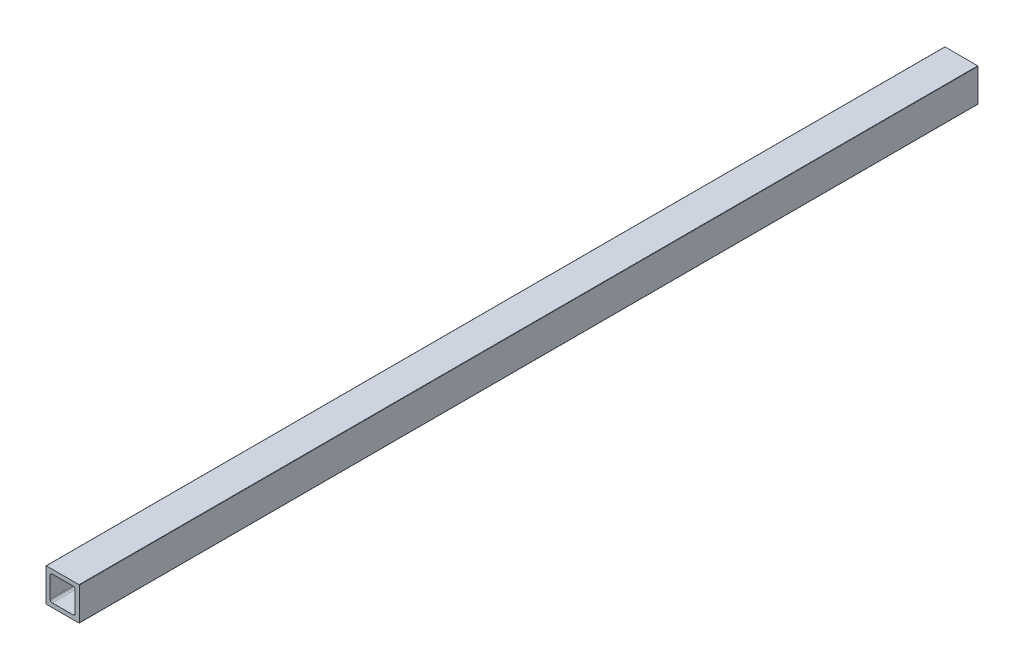
ISO-10303-21;
HEADER;
FILE_DESCRIPTION(('STEP AP214'),'2;1');
FILE_NAME('part.step','',(''),(''),'','','');
FILE_SCHEMA(('AUTOMOTIVE_DESIGN { 1 0 10303 214 1 1 1 1 }'));
ENDSEC;
DATA;
#1=APPLICATION_CONTEXT('core data for automotive mechanical design processes');
#2=APPLICATION_PROTOCOL_DEFINITION('international standard','automotive_design',2000,#1);
#3=PRODUCT_CONTEXT('',#1,'mechanical');
#4=PRODUCT('Part','Part','',(#3));
#5=PRODUCT_RELATED_PRODUCT_CATEGORY('part','',(#4));
#6=PRODUCT_DEFINITION_FORMATION('','',#4);
#7=PRODUCT_DEFINITION_CONTEXT('part definition',#1,'design');
#8=PRODUCT_DEFINITION('design','',#6,#7);
#9=PRODUCT_DEFINITION_SHAPE('','',#8);
#10=(LENGTH_UNIT() NAMED_UNIT(*) SI_UNIT(.MILLI.,.METRE.));
#11=(NAMED_UNIT(*) PLANE_ANGLE_UNIT() SI_UNIT($,.RADIAN.));
#12=(NAMED_UNIT(*) SI_UNIT($,.STERADIAN.) SOLID_ANGLE_UNIT());
#13=UNCERTAINTY_MEASURE_WITH_UNIT(LENGTH_MEASURE(1.E-05),#10,'distance_accuracy_value','');
#14=(GEOMETRIC_REPRESENTATION_CONTEXT(3) GLOBAL_UNCERTAINTY_ASSIGNED_CONTEXT((#13)) GLOBAL_UNIT_ASSIGNED_CONTEXT((#10,
#11,#12)) REPRESENTATION_CONTEXT('',''));
#15=CARTESIAN_POINT('',(0.,0.,0.));
#16=DIRECTION('',(0.,0.,1.));
#17=DIRECTION('',(1.,0.,0.));
#18=AXIS2_PLACEMENT_3D('',#15,#16,#17);
#19=CARTESIAN_POINT('',(0.254,0.254,0.));
#20=DIRECTION('',(0.,0.,-1.));
#21=DIRECTION('',(0.,-1.,0.));
#22=AXIS2_PLACEMENT_3D('',#19,#20,#21);
#23=PLANE('',#22);
#24=CARTESIAN_POINT('',(0.254,0.254,0.));
#25=DIRECTION('',(0.,0.,1.));
#26=DIRECTION('',(-1.,0.,0.));
#27=AXIS2_PLACEMENT_3D('',#24,#25,#26);
#28=CIRCLE('',#27,0.254);
#29=CARTESIAN_POINT('',(0.,0.254,0.));
#30=VERTEX_POINT('',#29);
#31=CARTESIAN_POINT('',(0.254,0.,0.));
#32=VERTEX_POINT('',#31);
#33=EDGE_CURVE('E193',#30,#32,#28,.T.);
#34=ORIENTED_EDGE('',*,*,#33,.F.);
#35=DIRECTION('',(0.,-1.,0.));
#36=VECTOR('',#35,1.);
#37=CARTESIAN_POINT('',(0.,0.254,0.));
#38=LINE('',#37,#36);
#39=CARTESIAN_POINT('',(0.,25.146,0.));
#40=VERTEX_POINT('',#39);
#41=EDGE_CURVE('E191',#40,#30,#38,.T.);
#42=ORIENTED_EDGE('',*,*,#41,.F.);
#43=CARTESIAN_POINT('',(0.254,25.146,0.));
#44=DIRECTION('',(0.,0.,1.));
#45=DIRECTION('',(-1.,0.,0.));
#46=AXIS2_PLACEMENT_3D('',#43,#44,#45);
#47=CIRCLE('',#46,0.254);
#48=CARTESIAN_POINT('',(0.254,25.4,0.));
#49=VERTEX_POINT('',#48);
#50=EDGE_CURVE('E213',#49,#40,#47,.T.);
#51=ORIENTED_EDGE('',*,*,#50,.F.);
#52=DIRECTION('',(-1.,0.,0.));
#53=VECTOR('',#52,1.);
#54=CARTESIAN_POINT('',(0.254,25.4,0.));
#55=LINE('',#54,#53);
#56=CARTESIAN_POINT('',(25.146,25.4,0.));
#57=VERTEX_POINT('',#56);
#58=EDGE_CURVE('E204',#57,#49,#55,.T.);
#59=ORIENTED_EDGE('',*,*,#58,.F.);
#60=CARTESIAN_POINT('',(25.146,25.146,0.));
#61=DIRECTION('',(0.,0.,1.));
#62=DIRECTION('',(-1.,0.,0.));
#63=AXIS2_PLACEMENT_3D('',#60,#61,#62);
#64=CIRCLE('',#63,0.254);
#65=CARTESIAN_POINT('',(25.4,25.146,0.));
#66=VERTEX_POINT('',#65);
#67=EDGE_CURVE('E236',#66,#57,#64,.T.);
#68=ORIENTED_EDGE('',*,*,#67,.F.);
#69=DIRECTION('',(0.,1.,0.));
#70=VECTOR('',#69,1.);
#71=CARTESIAN_POINT('',(25.4,0.254,0.));
#72=LINE('',#71,#70);
#73=CARTESIAN_POINT('',(25.4,0.254,0.));
#74=VERTEX_POINT('',#73);
#75=EDGE_CURVE('E235',#74,#66,#72,.T.);
#76=ORIENTED_EDGE('',*,*,#75,.F.);
#77=CARTESIAN_POINT('',(25.146,0.254,0.));
#78=DIRECTION('',(0.,0.,1.));
#79=DIRECTION('',(1.,0.,0.));
#80=AXIS2_PLACEMENT_3D('',#77,#78,#79);
#81=CIRCLE('',#80,0.254);
#82=CARTESIAN_POINT('',(25.146,0.,0.));
#83=VERTEX_POINT('',#82);
#84=EDGE_CURVE('E206',#83,#74,#81,.T.);
#85=ORIENTED_EDGE('',*,*,#84,.F.);
#86=DIRECTION('',(1.,0.,0.));
#87=VECTOR('',#86,1.);
#88=CARTESIAN_POINT('',(0.254,0.,0.));
#89=LINE('',#88,#87);
#90=EDGE_CURVE('E194',#32,#83,#89,.T.);
#91=ORIENTED_EDGE('',*,*,#90,.F.);
#92=EDGE_LOOP('',(#34,#42,#51,#59,#68,#76,#85,#91));
#93=FACE_BOUND('',#92,.T.);
#94=DIRECTION('',(0.,-1.,0.));
#95=VECTOR('',#94,1.);
#96=CARTESIAN_POINT('',(3.175,4.7625,0.));
#97=LINE('',#96,#95);
#98=CARTESIAN_POINT('',(3.175,20.6375,0.));
#99=VERTEX_POINT('',#98);
#100=CARTESIAN_POINT('',(3.175,4.7625,0.));
#101=VERTEX_POINT('',#100);
#102=EDGE_CURVE('E52',#99,#101,#97,.T.);
#103=ORIENTED_EDGE('',*,*,#102,.T.);
#104=CARTESIAN_POINT('',(4.7625,4.7625,0.));
#105=DIRECTION('',(0.,0.,1.));
#106=DIRECTION('',(1.,0.,0.));
#107=AXIS2_PLACEMENT_3D('',#104,#105,#106);
#108=CIRCLE('',#107,1.5875);
#109=CARTESIAN_POINT('',(4.7625,3.175,0.));
#110=VERTEX_POINT('',#109);
#111=EDGE_CURVE('E266',#101,#110,#108,.T.);
#112=ORIENTED_EDGE('',*,*,#111,.T.);
#113=DIRECTION('',(1.,0.,0.));
#114=VECTOR('',#113,1.);
#115=CARTESIAN_POINT('',(4.7625,3.175,0.));
#116=LINE('',#115,#114);
#117=CARTESIAN_POINT('',(20.6375,3.175,0.));
#118=VERTEX_POINT('',#117);
#119=EDGE_CURVE('E250',#110,#118,#116,.T.);
#120=ORIENTED_EDGE('',*,*,#119,.T.);
#121=CARTESIAN_POINT('',(20.6375,4.7625,0.));
#122=DIRECTION('',(0.,0.,1.));
#123=DIRECTION('',(-1.,0.,0.));
#124=AXIS2_PLACEMENT_3D('',#121,#122,#123);
#125=CIRCLE('',#124,1.5875);
#126=CARTESIAN_POINT('',(22.225,4.7625,0.));
#127=VERTEX_POINT('',#126);
#128=EDGE_CURVE('E223',#118,#127,#125,.T.);
#129=ORIENTED_EDGE('',*,*,#128,.T.);
#130=DIRECTION('',(0.,1.,0.));
#131=VECTOR('',#130,1.);
#132=CARTESIAN_POINT('',(22.225,4.7625,0.));
#133=LINE('',#132,#131);
#134=CARTESIAN_POINT('',(22.225,20.6375,0.));
#135=VERTEX_POINT('',#134);
#136=EDGE_CURVE('E219',#127,#135,#133,.T.);
#137=ORIENTED_EDGE('',*,*,#136,.T.);
#138=CARTESIAN_POINT('',(20.6375,20.6375,0.));
#139=DIRECTION('',(0.,0.,1.));
#140=DIRECTION('',(-1.,0.,0.));
#141=AXIS2_PLACEMENT_3D('',#138,#139,#140);
#142=CIRCLE('',#141,1.5875);
#143=CARTESIAN_POINT('',(20.6375,22.225,0.));
#144=VERTEX_POINT('',#143);
#145=EDGE_CURVE('E224',#135,#144,#142,.T.);
#146=ORIENTED_EDGE('',*,*,#145,.T.);
#147=DIRECTION('',(-1.,0.,0.));
#148=VECTOR('',#147,1.);
#149=CARTESIAN_POINT('',(4.7625,22.225,0.));
#150=LINE('',#149,#148);
#151=CARTESIAN_POINT('',(4.7625,22.225,0.));
#152=VERTEX_POINT('',#151);
#153=EDGE_CURVE('E229',#144,#152,#150,.T.);
#154=ORIENTED_EDGE('',*,*,#153,.T.);
#155=CARTESIAN_POINT('',(4.7625,20.6375,0.));
#156=DIRECTION('',(0.,0.,1.));
#157=DIRECTION('',(-1.,0.,0.));
#158=AXIS2_PLACEMENT_3D('',#155,#156,#157);
#159=CIRCLE('',#158,1.5875);
#160=EDGE_CURVE('E197',#152,#99,#159,.T.);
#161=ORIENTED_EDGE('',*,*,#160,.T.);
#162=EDGE_LOOP('',(#103,#112,#120,#129,#137,#146,#154,#161));
#163=FACE_BOUND('',#162,.T.);
#164=ADVANCED_FACE('F44',(#93,#163),#23,.T.);
#165=CARTESIAN_POINT('',(0.254,0.254,1828.8));
#166=DIRECTION('',(0.,0.,-1.));
#167=DIRECTION('',(-1.,0.,0.));
#168=AXIS2_PLACEMENT_3D('',#165,#166,#167);
#169=CYLINDRICAL_SURFACE('',#168,0.254);
#170=CARTESIAN_POINT('',(0.254,0.254,685.8));
#171=DIRECTION('',(0.,0.,-1.));
#172=DIRECTION('',(-1.,0.,0.));
#173=AXIS2_PLACEMENT_3D('',#170,#171,#172);
#174=CIRCLE('',#173,0.254);
#175=CARTESIAN_POINT('',(0.,0.254,685.8));
#176=VERTEX_POINT('',#175);
#177=CARTESIAN_POINT('',(0.254,0.,685.8));
#178=VERTEX_POINT('',#177);
#179=EDGE_CURVE('E172',#176,#178,#174,.F.);
#180=ORIENTED_EDGE('',*,*,#179,.F.);
#181=DIRECTION('',(0.,0.,-1.));
#182=VECTOR('',#181,1.);
#183=CARTESIAN_POINT('',(0.,0.254,1828.8));
#184=LINE('',#183,#182);
#185=EDGE_CURVE('E183',#176,#30,#184,.T.);
#186=ORIENTED_EDGE('',*,*,#185,.T.);
#187=ORIENTED_EDGE('',*,*,#33,.T.);
#188=DIRECTION('',(0.,0.,-1.));
#189=VECTOR('',#188,1.);
#190=CARTESIAN_POINT('',(0.254,0.,1828.8));
#191=LINE('',#190,#189);
#192=EDGE_CURVE('E185',#178,#32,#191,.T.);
#193=ORIENTED_EDGE('',*,*,#192,.F.);
#194=EDGE_LOOP('',(#180,#186,#187,#193));
#195=FACE_BOUND('',#194,.T.);
#196=ADVANCED_FACE('F181',(#195),#169,.T.);
#197=CARTESIAN_POINT('',(0.254,0.,1828.8));
#198=DIRECTION('',(0.,1.,0.));
#199=DIRECTION('',(1.,0.,0.));
#200=AXIS2_PLACEMENT_3D('',#197,#198,#199);
#201=PLANE('',#200);
#202=DIRECTION('',(0.,0.,-1.));
#203=VECTOR('',#202,1.);
#204=CARTESIAN_POINT('',(25.146,0.,1828.8));
#205=LINE('',#204,#203);
#206=CARTESIAN_POINT('',(25.146,0.,685.8));
#207=VERTEX_POINT('',#206);
#208=EDGE_CURVE('E210',#207,#83,#205,.T.);
#209=ORIENTED_EDGE('',*,*,#208,.F.);
#210=DIRECTION('',(1.,0.,0.));
#211=VECTOR('',#210,1.);
#212=CARTESIAN_POINT('',(0.,0.,685.8));
#213=LINE('',#212,#211);
#214=EDGE_CURVE('E177',#178,#207,#213,.T.);
#215=ORIENTED_EDGE('',*,*,#214,.F.);
#216=ORIENTED_EDGE('',*,*,#192,.T.);
#217=ORIENTED_EDGE('',*,*,#90,.T.);
#218=EDGE_LOOP('',(#209,#215,#216,#217));
#219=FACE_BOUND('',#218,.T.);
#220=ADVANCED_FACE('F289',(#219),#201,.F.);
#221=CARTESIAN_POINT('',(25.146,0.254,1828.8));
#222=DIRECTION('',(0.,0.,-1.));
#223=DIRECTION('',(-1.,0.,0.));
#224=AXIS2_PLACEMENT_3D('',#221,#222,#223);
#225=CYLINDRICAL_SURFACE('',#224,0.254);
#226=CARTESIAN_POINT('',(25.146,0.254,685.8));
#227=DIRECTION('',(0.,0.,-1.));
#228=DIRECTION('',(-1.,0.,0.));
#229=AXIS2_PLACEMENT_3D('',#226,#227,#228);
#230=CIRCLE('',#229,0.254);
#231=CARTESIAN_POINT('',(25.4,0.254,685.8));
#232=VERTEX_POINT('',#231);
#233=EDGE_CURVE('E187',#207,#232,#230,.F.);
#234=ORIENTED_EDGE('',*,*,#233,.F.);
#235=ORIENTED_EDGE('',*,*,#208,.T.);
#236=ORIENTED_EDGE('',*,*,#84,.T.);
#237=DIRECTION('',(0.,0.,-1.));
#238=VECTOR('',#237,1.);
#239=CARTESIAN_POINT('',(25.4,0.254,1828.8));
#240=LINE('',#239,#238);
#241=EDGE_CURVE('E233',#232,#74,#240,.T.);
#242=ORIENTED_EDGE('',*,*,#241,.F.);
#243=EDGE_LOOP('',(#234,#235,#236,#242));
#244=FACE_BOUND('',#243,.T.);
#245=ADVANCED_FACE('F283',(#244),#225,.T.);
#246=CARTESIAN_POINT('',(25.4,0.254,1828.8));
#247=DIRECTION('',(-1.,0.,0.));
#248=DIRECTION('',(0.,0.,1.));
#249=AXIS2_PLACEMENT_3D('',#246,#247,#248);
#250=PLANE('',#249);
#251=DIRECTION('',(0.,0.,-1.));
#252=VECTOR('',#251,1.);
#253=CARTESIAN_POINT('',(25.4,25.146,1828.8));
#254=LINE('',#253,#252);
#255=CARTESIAN_POINT('',(25.4,25.146,685.8));
#256=VERTEX_POINT('',#255);
#257=EDGE_CURVE('E258',#256,#66,#254,.T.);
#258=ORIENTED_EDGE('',*,*,#257,.F.);
#259=DIRECTION('',(0.,1.,0.));
#260=VECTOR('',#259,1.);
#261=CARTESIAN_POINT('',(25.4,0.,685.8));
#262=LINE('',#261,#260);
#263=EDGE_CURVE('E498',#232,#256,#262,.T.);
#264=ORIENTED_EDGE('',*,*,#263,.F.);
#265=ORIENTED_EDGE('',*,*,#241,.T.);
#266=ORIENTED_EDGE('',*,*,#75,.T.);
#267=EDGE_LOOP('',(#258,#264,#265,#266));
#268=FACE_BOUND('',#267,.T.);
#269=ADVANCED_FACE('F288',(#268),#250,.F.);
#270=CARTESIAN_POINT('',(25.146,25.146,1828.8));
#271=DIRECTION('',(0.,0.,-1.));
#272=DIRECTION('',(-1.,0.,0.));
#273=AXIS2_PLACEMENT_3D('',#270,#271,#272);
#274=CYLINDRICAL_SURFACE('',#273,0.254);
#275=CARTESIAN_POINT('',(25.146,25.146,685.8));
#276=DIRECTION('',(0.,0.,-1.));
#277=DIRECTION('',(-1.,0.,0.));
#278=AXIS2_PLACEMENT_3D('',#275,#276,#277);
#279=CIRCLE('',#278,0.254);
#280=CARTESIAN_POINT('',(25.146,25.4,685.8));
#281=VERTEX_POINT('',#280);
#282=EDGE_CURVE('E492',#256,#281,#279,.F.);
#283=ORIENTED_EDGE('',*,*,#282,.F.);
#284=ORIENTED_EDGE('',*,*,#257,.T.);
#285=ORIENTED_EDGE('',*,*,#67,.T.);
#286=DIRECTION('',(0.,0.,-1.));
#287=VECTOR('',#286,1.);
#288=CARTESIAN_POINT('',(25.146,25.4,1828.8));
#289=LINE('',#288,#287);
#290=EDGE_CURVE('E227',#281,#57,#289,.T.);
#291=ORIENTED_EDGE('',*,*,#290,.F.);
#292=EDGE_LOOP('',(#283,#284,#285,#291));
#293=FACE_BOUND('',#292,.T.);
#294=ADVANCED_FACE('F46',(#293),#274,.T.);
#295=CARTESIAN_POINT('',(0.254,25.4,1828.8));
#296=DIRECTION('',(0.,-1.,0.));
#297=DIRECTION('',(0.,0.,-1.));
#298=AXIS2_PLACEMENT_3D('',#295,#296,#297);
#299=PLANE('',#298);
#300=DIRECTION('',(0.,0.,-1.));
#301=VECTOR('',#300,1.);
#302=CARTESIAN_POINT('',(0.254,25.4,1828.8));
#303=LINE('',#302,#301);
#304=CARTESIAN_POINT('',(0.254,25.4,685.8));
#305=VERTEX_POINT('',#304);
#306=EDGE_CURVE('E211',#305,#49,#303,.T.);
#307=ORIENTED_EDGE('',*,*,#306,.F.);
#308=DIRECTION('',(-1.,0.,0.));
#309=VECTOR('',#308,1.);
#310=CARTESIAN_POINT('',(0.,25.4,685.8));
#311=LINE('',#310,#309);
#312=EDGE_CURVE('E545',#281,#305,#311,.T.);
#313=ORIENTED_EDGE('',*,*,#312,.F.);
#314=ORIENTED_EDGE('',*,*,#290,.T.);
#315=ORIENTED_EDGE('',*,*,#58,.T.);
#316=EDGE_LOOP('',(#307,#313,#314,#315));
#317=FACE_BOUND('',#316,.T.);
#318=ADVANCED_FACE('F347',(#317),#299,.F.);
#319=CARTESIAN_POINT('',(0.254,25.146,1828.8));
#320=DIRECTION('',(0.,0.,-1.));
#321=DIRECTION('',(-1.,0.,0.));
#322=AXIS2_PLACEMENT_3D('',#319,#320,#321);
#323=CYLINDRICAL_SURFACE('',#322,0.254);
#324=CARTESIAN_POINT('',(0.254,25.146,685.8));
#325=DIRECTION('',(0.,0.,-1.));
#326=DIRECTION('',(-1.,0.,0.));
#327=AXIS2_PLACEMENT_3D('',#324,#325,#326);
#328=CIRCLE('',#327,0.254);
#329=CARTESIAN_POINT('',(0.,25.146,685.8));
#330=VERTEX_POINT('',#329);
#331=EDGE_CURVE('E59',#305,#330,#328,.F.);
#332=ORIENTED_EDGE('',*,*,#331,.F.);
#333=ORIENTED_EDGE('',*,*,#306,.T.);
#334=ORIENTED_EDGE('',*,*,#50,.T.);
#335=DIRECTION('',(0.,0.,-1.));
#336=VECTOR('',#335,1.);
#337=CARTESIAN_POINT('',(0.,25.146,1828.8));
#338=LINE('',#337,#336);
#339=EDGE_CURVE('E216',#330,#40,#338,.T.);
#340=ORIENTED_EDGE('',*,*,#339,.F.);
#341=EDGE_LOOP('',(#332,#333,#334,#340));
#342=FACE_BOUND('',#341,.T.);
#343=ADVANCED_FACE('F276',(#342),#323,.T.);
#344=CARTESIAN_POINT('',(0.,0.254,1828.8));
#345=DIRECTION('',(1.,0.,0.));
#346=DIRECTION('',(0.,1.,0.));
#347=AXIS2_PLACEMENT_3D('',#344,#345,#346);
#348=PLANE('',#347);
#349=ORIENTED_EDGE('',*,*,#185,.F.);
#350=DIRECTION('',(0.,-1.,0.));
#351=VECTOR('',#350,1.);
#352=CARTESIAN_POINT('',(0.,0.,685.8));
#353=LINE('',#352,#351);
#354=EDGE_CURVE('E169',#330,#176,#353,.T.);
#355=ORIENTED_EDGE('',*,*,#354,.F.);
#356=ORIENTED_EDGE('',*,*,#339,.T.);
#357=ORIENTED_EDGE('',*,*,#41,.T.);
#358=EDGE_LOOP('',(#349,#355,#356,#357));
#359=FACE_BOUND('',#358,.T.);
#360=ADVANCED_FACE('F189',(#359),#348,.F.);
#361=CARTESIAN_POINT('',(4.7625,4.7625,1828.8));
#362=DIRECTION('',(0.,0.,-1.));
#363=DIRECTION('',(-1.,0.,0.));
#364=AXIS2_PLACEMENT_3D('',#361,#362,#363);
#365=CYLINDRICAL_SURFACE('',#364,1.5875);
#366=DIRECTION('',(0.,0.,-1.));
#367=VECTOR('',#366,1.);
#368=CARTESIAN_POINT('',(3.175,4.7625,1828.8));
#369=LINE('',#368,#367);
#370=CARTESIAN_POINT('',(3.175,4.7625,685.8));
#371=VERTEX_POINT('',#370);
#372=EDGE_CURVE('E186',#371,#101,#369,.T.);
#373=ORIENTED_EDGE('',*,*,#372,.F.);
#374=CARTESIAN_POINT('',(4.7625,4.7625,685.8));
#375=DIRECTION('',(0.,0.,-1.));
#376=DIRECTION('',(-1.,0.,0.));
#377=AXIS2_PLACEMENT_3D('',#374,#375,#376);
#378=CIRCLE('',#377,1.5875);
#379=CARTESIAN_POINT('',(4.7625,3.175,685.8));
#380=VERTEX_POINT('',#379);
#381=EDGE_CURVE('E66',#371,#380,#378,.F.);
#382=ORIENTED_EDGE('',*,*,#381,.T.);
#383=DIRECTION('',(0.,0.,-1.));
#384=VECTOR('',#383,1.);
#385=CARTESIAN_POINT('',(4.7625,3.175,1828.8));
#386=LINE('',#385,#384);
#387=EDGE_CURVE('E214',#380,#110,#386,.T.);
#388=ORIENTED_EDGE('',*,*,#387,.T.);
#389=ORIENTED_EDGE('',*,*,#111,.F.);
#390=EDGE_LOOP('',(#373,#382,#388,#389));
#391=FACE_BOUND('',#390,.T.);
#392=ADVANCED_FACE('F275',(#391),#365,.F.);
#393=CARTESIAN_POINT('',(4.7625,3.175,1828.8));
#394=DIRECTION('',(0.,1.,0.));
#395=DIRECTION('',(1.,0.,0.));
#396=AXIS2_PLACEMENT_3D('',#393,#394,#395);
#397=PLANE('',#396);
#398=DIRECTION('',(-1.,0.,0.));
#399=VECTOR('',#398,1.);
#400=CARTESIAN_POINT('',(4.7625,3.175,685.8));
#401=LINE('',#400,#399);
#402=CARTESIAN_POINT('',(20.6375,3.175,685.8));
#403=VERTEX_POINT('',#402);
#404=EDGE_CURVE('E532',#403,#380,#401,.T.);
#405=ORIENTED_EDGE('',*,*,#404,.F.);
#406=DIRECTION('',(0.,0.,-1.));
#407=VECTOR('',#406,1.);
#408=CARTESIAN_POINT('',(20.6375,3.175,1828.8));
#409=LINE('',#408,#407);
#410=EDGE_CURVE('E217',#403,#118,#409,.T.);
#411=ORIENTED_EDGE('',*,*,#410,.T.);
#412=ORIENTED_EDGE('',*,*,#119,.F.);
#413=ORIENTED_EDGE('',*,*,#387,.F.);
#414=EDGE_LOOP('',(#405,#411,#412,#413));
#415=FACE_BOUND('',#414,.T.);
#416=ADVANCED_FACE('F302',(#415),#397,.T.);
#417=CARTESIAN_POINT('',(20.6375,4.7625,1828.8));
#418=DIRECTION('',(0.,0.,-1.));
#419=DIRECTION('',(-1.,0.,0.));
#420=AXIS2_PLACEMENT_3D('',#417,#418,#419);
#421=CYLINDRICAL_SURFACE('',#420,1.5875);
#422=ORIENTED_EDGE('',*,*,#410,.F.);
#423=CARTESIAN_POINT('',(20.6375,4.7625,685.8));
#424=DIRECTION('',(0.,0.,-1.));
#425=DIRECTION('',(-1.,0.,0.));
#426=AXIS2_PLACEMENT_3D('',#423,#424,#425);
#427=CIRCLE('',#426,1.5875);
#428=CARTESIAN_POINT('',(22.225,4.7625,685.8));
#429=VERTEX_POINT('',#428);
#430=EDGE_CURVE('E513',#403,#429,#427,.F.);
#431=ORIENTED_EDGE('',*,*,#430,.T.);
#432=DIRECTION('',(0.,0.,-1.));
#433=VECTOR('',#432,1.);
#434=CARTESIAN_POINT('',(22.225,4.7625,1828.8));
#435=LINE('',#434,#433);
#436=EDGE_CURVE('E254',#429,#127,#435,.T.);
#437=ORIENTED_EDGE('',*,*,#436,.T.);
#438=ORIENTED_EDGE('',*,*,#128,.F.);
#439=EDGE_LOOP('',(#422,#431,#437,#438));
#440=FACE_BOUND('',#439,.T.);
#441=ADVANCED_FACE('F297',(#440),#421,.F.);
#442=CARTESIAN_POINT('',(22.225,4.7625,1828.8));
#443=DIRECTION('',(-1.,0.,0.));
#444=DIRECTION('',(0.,0.,1.));
#445=AXIS2_PLACEMENT_3D('',#442,#443,#444);
#446=PLANE('',#445);
#447=DIRECTION('',(0.,-1.,0.));
#448=VECTOR('',#447,1.);
#449=CARTESIAN_POINT('',(22.225,4.7625,685.8));
#450=LINE('',#449,#448);
#451=CARTESIAN_POINT('',(22.225,20.6375,685.8));
#452=VERTEX_POINT('',#451);
#453=EDGE_CURVE('E535',#452,#429,#450,.T.);
#454=ORIENTED_EDGE('',*,*,#453,.F.);
#455=DIRECTION('',(0.,0.,-1.));
#456=VECTOR('',#455,1.);
#457=CARTESIAN_POINT('',(22.225,20.6375,1828.8));
#458=LINE('',#457,#456);
#459=EDGE_CURVE('E240',#452,#135,#458,.T.);
#460=ORIENTED_EDGE('',*,*,#459,.T.);
#461=ORIENTED_EDGE('',*,*,#136,.F.);
#462=ORIENTED_EDGE('',*,*,#436,.F.);
#463=EDGE_LOOP('',(#454,#460,#461,#462));
#464=FACE_BOUND('',#463,.T.);
#465=ADVANCED_FACE('F301',(#464),#446,.T.);
#466=CARTESIAN_POINT('',(20.6375,20.6375,1828.8));
#467=DIRECTION('',(0.,0.,-1.));
#468=DIRECTION('',(-1.,0.,0.));
#469=AXIS2_PLACEMENT_3D('',#466,#467,#468);
#470=CYLINDRICAL_SURFACE('',#469,1.5875);
#471=ORIENTED_EDGE('',*,*,#459,.F.);
#472=CARTESIAN_POINT('',(20.6375,20.6375,685.8));
#473=DIRECTION('',(0.,0.,-1.));
#474=DIRECTION('',(-1.,0.,0.));
#475=AXIS2_PLACEMENT_3D('',#472,#473,#474);
#476=CIRCLE('',#475,1.5875);
#477=CARTESIAN_POINT('',(20.6375,22.225,685.8));
#478=VERTEX_POINT('',#477);
#479=EDGE_CURVE('E537',#452,#478,#476,.F.);
#480=ORIENTED_EDGE('',*,*,#479,.T.);
#481=DIRECTION('',(0.,0.,-1.));
#482=VECTOR('',#481,1.);
#483=CARTESIAN_POINT('',(20.6375,22.225,1828.8));
#484=LINE('',#483,#482);
#485=EDGE_CURVE('E238',#478,#144,#484,.T.);
#486=ORIENTED_EDGE('',*,*,#485,.T.);
#487=ORIENTED_EDGE('',*,*,#145,.F.);
#488=EDGE_LOOP('',(#471,#480,#486,#487));
#489=FACE_BOUND('',#488,.T.);
#490=ADVANCED_FACE('F309',(#489),#470,.F.);
#491=CARTESIAN_POINT('',(4.7625,22.225,1828.8));
#492=DIRECTION('',(0.,-1.,0.));
#493=DIRECTION('',(0.,0.,-1.));
#494=AXIS2_PLACEMENT_3D('',#491,#492,#493);
#495=PLANE('',#494);
#496=DIRECTION('',(1.,0.,0.));
#497=VECTOR('',#496,1.);
#498=CARTESIAN_POINT('',(4.7625,22.225,685.8));
#499=LINE('',#498,#497);
#500=CARTESIAN_POINT('',(4.7625,22.225,685.8));
#501=VERTEX_POINT('',#500);
#502=EDGE_CURVE('E540',#501,#478,#499,.T.);
#503=ORIENTED_EDGE('',*,*,#502,.F.);
#504=DIRECTION('',(0.,0.,-1.));
#505=VECTOR('',#504,1.);
#506=CARTESIAN_POINT('',(4.7625,22.225,1828.8));
#507=LINE('',#506,#505);
#508=EDGE_CURVE('E241',#501,#152,#507,.T.);
#509=ORIENTED_EDGE('',*,*,#508,.T.);
#510=ORIENTED_EDGE('',*,*,#153,.F.);
#511=ORIENTED_EDGE('',*,*,#485,.F.);
#512=EDGE_LOOP('',(#503,#509,#510,#511));
#513=FACE_BOUND('',#512,.T.);
#514=ADVANCED_FACE('F313',(#513),#495,.T.);
#515=CARTESIAN_POINT('',(4.7625,20.6375,1828.8));
#516=DIRECTION('',(0.,0.,-1.));
#517=DIRECTION('',(-1.,0.,0.));
#518=AXIS2_PLACEMENT_3D('',#515,#516,#517);
#519=CYLINDRICAL_SURFACE('',#518,1.5875);
#520=ORIENTED_EDGE('',*,*,#508,.F.);
#521=CARTESIAN_POINT('',(4.7625,20.6375,685.8));
#522=DIRECTION('',(0.,0.,-1.));
#523=DIRECTION('',(-1.,0.,0.));
#524=AXIS2_PLACEMENT_3D('',#521,#522,#523);
#525=CIRCLE('',#524,1.5875);
#526=CARTESIAN_POINT('',(3.175,20.6375,685.8));
#527=VERTEX_POINT('',#526);
#528=EDGE_CURVE('E542',#501,#527,#525,.F.);
#529=ORIENTED_EDGE('',*,*,#528,.T.);
#530=DIRECTION('',(0.,0.,-1.));
#531=VECTOR('',#530,1.);
#532=CARTESIAN_POINT('',(3.175,20.6375,1828.8));
#533=LINE('',#532,#531);
#534=EDGE_CURVE('E245',#527,#99,#533,.T.);
#535=ORIENTED_EDGE('',*,*,#534,.T.);
#536=ORIENTED_EDGE('',*,*,#160,.F.);
#537=EDGE_LOOP('',(#520,#529,#535,#536));
#538=FACE_BOUND('',#537,.T.);
#539=ADVANCED_FACE('F390',(#538),#519,.F.);
#540=CARTESIAN_POINT('',(3.175,4.7625,1828.8));
#541=DIRECTION('',(1.,0.,0.));
#542=DIRECTION('',(0.,1.,0.));
#543=AXIS2_PLACEMENT_3D('',#540,#541,#542);
#544=PLANE('',#543);
#545=DIRECTION('',(0.,1.,0.));
#546=VECTOR('',#545,1.);
#547=CARTESIAN_POINT('',(3.175,4.7625,685.8));
#548=LINE('',#547,#546);
#549=EDGE_CURVE('E11',#371,#527,#548,.T.);
#550=ORIENTED_EDGE('',*,*,#549,.F.);
#551=ORIENTED_EDGE('',*,*,#372,.T.);
#552=ORIENTED_EDGE('',*,*,#102,.F.);
#553=ORIENTED_EDGE('',*,*,#534,.F.);
#554=EDGE_LOOP('',(#550,#551,#552,#553));
#555=FACE_BOUND('',#554,.T.);
#556=ADVANCED_FACE('F394',(#555),#544,.T.);
#557=CARTESIAN_POINT('',(0.,0.,685.8));
#558=DIRECTION('',(0.,0.,-1.));
#559=DIRECTION('',(-1.,0.,0.));
#560=AXIS2_PLACEMENT_3D('',#557,#558,#559);
#561=PLANE('',#560);
#562=ORIENTED_EDGE('',*,*,#179,.T.);
#563=ORIENTED_EDGE('',*,*,#214,.T.);
#564=ORIENTED_EDGE('',*,*,#233,.T.);
#565=ORIENTED_EDGE('',*,*,#263,.T.);
#566=ORIENTED_EDGE('',*,*,#282,.T.);
#567=ORIENTED_EDGE('',*,*,#312,.T.);
#568=ORIENTED_EDGE('',*,*,#331,.T.);
#569=ORIENTED_EDGE('',*,*,#354,.T.);
#570=EDGE_LOOP('',(#562,#563,#564,#565,#566,#567,#568,#569));
#571=FACE_BOUND('',#570,.T.);
#572=ORIENTED_EDGE('',*,*,#549,.T.);
#573=ORIENTED_EDGE('',*,*,#528,.F.);
#574=ORIENTED_EDGE('',*,*,#502,.T.);
#575=ORIENTED_EDGE('',*,*,#479,.F.);
#576=ORIENTED_EDGE('',*,*,#453,.T.);
#577=ORIENTED_EDGE('',*,*,#430,.F.);
#578=ORIENTED_EDGE('',*,*,#404,.T.);
#579=ORIENTED_EDGE('',*,*,#381,.F.);
#580=EDGE_LOOP('',(#572,#573,#574,#575,#576,#577,#578,#579));
#581=FACE_BOUND('',#580,.T.);
#582=ADVANCED_FACE('F171',(#571,#581),#561,.F.);
#583=CLOSED_SHELL('',(#164,#196,#220,#245,#269,#294,#318,#343,#360,#392,#416,#441,#465,#490,
#514,#539,#556,#582));
#584=MANIFOLD_SOLID_BREP('B2',#583);
#585=ADVANCED_BREP_SHAPE_REPRESENTATION('',(#18,#584),#14);
#586=SHAPE_DEFINITION_REPRESENTATION(#9,#585);
ENDSEC;
END-ISO-10303-21;
